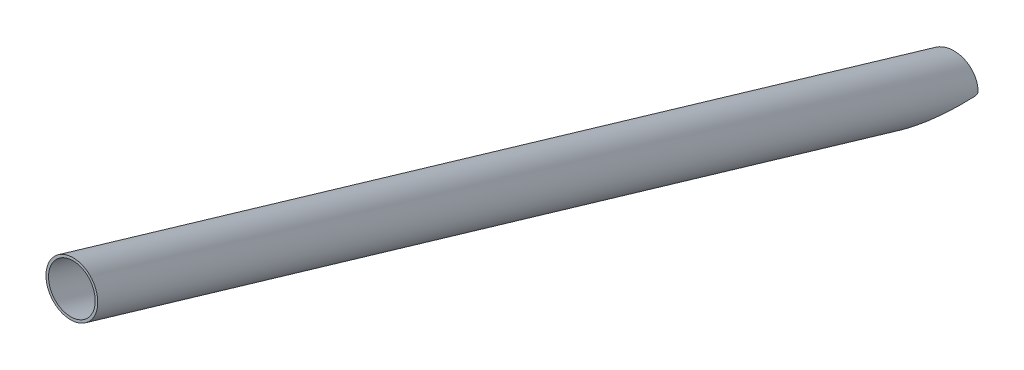
ISO-10303-21;
HEADER;
FILE_DESCRIPTION(('STEP AP214'),'2;1');
FILE_NAME('part.step','',(''),(''),'','','');
FILE_SCHEMA(('AUTOMOTIVE_DESIGN { 1 0 10303 214 1 1 1 1 }'));
ENDSEC;
DATA;
#1=APPLICATION_CONTEXT('core data for automotive mechanical design processes');
#2=APPLICATION_PROTOCOL_DEFINITION('international standard','automotive_design',2000,#1);
#3=PRODUCT_CONTEXT('',#1,'mechanical');
#4=PRODUCT('Part','Part','',(#3));
#5=PRODUCT_RELATED_PRODUCT_CATEGORY('part','',(#4));
#6=PRODUCT_DEFINITION_FORMATION('','',#4);
#7=PRODUCT_DEFINITION_CONTEXT('part definition',#1,'design');
#8=PRODUCT_DEFINITION('design','',#6,#7);
#9=PRODUCT_DEFINITION_SHAPE('','',#8);
#10=(LENGTH_UNIT() NAMED_UNIT(*) SI_UNIT(.MILLI.,.METRE.));
#11=(NAMED_UNIT(*) PLANE_ANGLE_UNIT() SI_UNIT($,.RADIAN.));
#12=(NAMED_UNIT(*) SI_UNIT($,.STERADIAN.) SOLID_ANGLE_UNIT());
#13=UNCERTAINTY_MEASURE_WITH_UNIT(LENGTH_MEASURE(1.E-05),#10,'distance_accuracy_value','');
#14=(GEOMETRIC_REPRESENTATION_CONTEXT(3) GLOBAL_UNCERTAINTY_ASSIGNED_CONTEXT((#13)) GLOBAL_UNIT_ASSIGNED_CONTEXT((#10,
#11,#12)) REPRESENTATION_CONTEXT('',''));
#15=CARTESIAN_POINT('',(0.,0.,0.));
#16=DIRECTION('',(0.,0.,1.));
#17=DIRECTION('',(1.,0.,0.));
#18=AXIS2_PLACEMENT_3D('',#15,#16,#17);
#19=CARTESIAN_POINT('',(-238.578451545622,263.413321195737,924.828445427609));
#20=DIRECTION('',(0.125935860789275,0.361465966011555,0.923841173786164));
#21=DIRECTION('',(0.,-0.93125547053293,0.364366914802225));
#22=AXIS2_PLACEMENT_3D('',#19,#20,#21);
#23=CYLINDRICAL_SURFACE('',#22,12.7);
#24=CARTESIAN_POINT('',(-170.006234196317,460.231944821897,1427.861));
#25=DIRECTION('',(0.,0.,-1.));
#26=DIRECTION('',(0.329006657768672,0.944327601600148,0.));
#27=AXIS2_PLACEMENT_3D('',#24,#25,#26);
#28=ELLIPSE('',#27,13.7469517059429,12.7);
#29=CARTESIAN_POINT('',(-165.483395561037,473.213570755683,1427.861));
#30=VERTEX_POINT('',#29);
#31=EDGE_CURVE('E158',#30,#30,#28,.T.);
#32=ORIENTED_EDGE('',*,*,#31,.T.);
#33=EDGE_LOOP('',(#32));
#34=FACE_BOUND('',#33,.T.);
#35=CARTESIAN_POINT('',(-238.578451545622,263.413321195737,924.828445427609));
#36=DIRECTION('',(-0.125935860789275,-0.361465966011555,-0.923841173786164));
#37=DIRECTION('',(0.,0.93125547053293,-0.364366914802225));
#38=AXIS2_PLACEMENT_3D('',#35,#36,#37);
#39=CIRCLE('',#38,12.7);
#40=CARTESIAN_POINT('',(-251.081438817546,262.535172699439,926.876411368864));
#41=VERTEX_POINT('',#40);
#42=CARTESIAN_POINT('',(-251.162272400533,264.573616407034,926.089860392689));
#43=VERTEX_POINT('',#42);
#44=EDGE_CURVE('E53',#41,#43,#39,.T.);
#45=ORIENTED_EDGE('',*,*,#44,.F.);
#46=CARTESIAN_POINT('',(-250.556242151783,263.705273976253,930.568275630507));
#47=CARTESIAN_POINT('',(-250.591679890808,263.692747162166,930.35505617303));
#48=CARTESIAN_POINT('',(-250.626563477498,263.680204805641,930.141739958165));
#49=CARTESIAN_POINT('',(-250.694896292358,263.653512658873,929.71681914362));
#50=CARTESIAN_POINT('',(-250.728355082375,263.639377201747,929.505215162217));
#51=CARTESIAN_POINT('',(-250.785687823963,263.611816011696,929.136232858172));
#52=CARTESIAN_POINT('',(-250.809822126205,263.599135500613,928.978844839189));
#53=CARTESIAN_POINT('',(-250.857567738819,263.570038493168,928.663214502132));
#54=CARTESIAN_POINT('',(-250.881174172364,263.553596328758,928.504973968348));
#55=CARTESIAN_POINT('',(-250.927851490643,263.513293413838,928.187518456917));
#56=CARTESIAN_POINT('',(-250.950914828331,263.489361316493,928.028309194384));
#57=CARTESIAN_POINT('',(-250.984404622596,263.439390355133,927.792861168643));
#58=CARTESIAN_POINT('',(-250.995342313322,263.420490699556,927.715241839458));
#59=CARTESIAN_POINT('',(-251.016601317001,263.374578855089,927.562433048013));
#60=CARTESIAN_POINT('',(-251.026924944019,263.347599787185,927.487235027703));
#61=CARTESIAN_POINT('',(-251.042620875733,263.292660746214,927.370054706212));
#62=CARTESIAN_POINT('',(-251.048393900079,263.268894848889,927.326226638534));
#63=CARTESIAN_POINT('',(-251.059043411533,263.214576885693,927.243004514204));
#64=CARTESIAN_POINT('',(-251.063923773435,263.184055484951,927.203591596388));
#65=CARTESIAN_POINT('',(-251.072413546349,263.115503293008,927.130951137884));
#66=CARTESIAN_POINT('',(-251.076010110848,263.077402233244,927.097787604495));
#67=CARTESIAN_POINT('',(-251.081614073025,262.995478506626,927.039196778219));
#68=CARTESIAN_POINT('',(-251.083616560906,262.95163864322,927.013793534144));
#69=CARTESIAN_POINT('',(-251.08666921081,262.840406194113,926.960029236648));
#70=CARTESIAN_POINT('',(-251.086893799656,262.771243820382,926.935420171396));
#71=CARTESIAN_POINT('',(-251.084876597143,262.630271939857,926.895410976376));
#72=CARTESIAN_POINT('',(-251.082622111923,262.558450645625,926.880058871834));
#73=CARTESIAN_POINT('',(-251.072523928205,262.331714823997,926.840299264213));
#74=CARTESIAN_POINT('',(-251.061238556869,262.175394789802,926.825514354734));
#75=CARTESIAN_POINT('',(-251.032056968746,261.862710047067,926.804838326577));
#76=CARTESIAN_POINT('',(-251.014140577809,261.706346672608,926.798974630882));
#77=CARTESIAN_POINT('',(-250.972286019535,261.393744666961,926.791500106254));
#78=CARTESIAN_POINT('',(-250.948327783011,261.237508227823,926.789903661001));
#79=CARTESIAN_POINT('',(-250.894786593018,260.926244816731,926.788758301734));
#80=CARTESIAN_POINT('',(-250.865211173792,260.77121651102,926.789206663379));
#81=CARTESIAN_POINT('',(-250.768435152783,260.308665871621,926.791964750888));
#82=CARTESIAN_POINT('',(-250.693067578914,260.002818026088,926.795682173394));
#83=CARTESIAN_POINT('',(-250.521214169932,259.396917709818,926.803156955561));
#84=CARTESIAN_POINT('',(-250.424712906181,259.096869648282,926.806914342482));
#85=CARTESIAN_POINT('',(-250.211276568941,258.50461339788,926.81311913272));
#86=CARTESIAN_POINT('',(-250.094372596908,258.212394046124,926.815568507198));
#87=CARTESIAN_POINT('',(-249.840566167649,257.636812772408,926.818423749536));
#88=CARTESIAN_POINT('',(-249.703665793054,257.353449931768,926.81882983005));
#89=CARTESIAN_POINT('',(-249.379613250768,256.738536473732,926.817006102438));
#90=CARTESIAN_POINT('',(-249.187944603153,256.40935381464,926.814205202772));
#91=CARTESIAN_POINT('',(-248.777261054299,255.768496868423,926.804528258209));
#92=CARTESIAN_POINT('',(-248.558240870682,255.456825980237,926.797651425167));
#93=CARTESIAN_POINT('',(-248.094046335052,254.853276346489,926.779523196075));
#94=CARTESIAN_POINT('',(-247.848848430215,254.561415817626,926.768267836063));
#95=CARTESIAN_POINT('',(-247.334106942527,254.000279238016,926.741198230068));
#96=CARTESIAN_POINT('',(-247.064565673123,253.731001045862,926.725384416981));
#97=CARTESIAN_POINT('',(-246.510803683587,253.224501077421,926.689601892037));
#98=CARTESIAN_POINT('',(-246.227199528773,252.986596147117,926.669760935795));
#99=CARTESIAN_POINT('',(-245.640685722603,252.536378139839,926.62564984796));
#100=CARTESIAN_POINT('',(-245.337776928344,252.324063927883,926.601379912917));
#101=CARTESIAN_POINT('',(-244.715190981461,251.927152212144,926.548479877139));
#102=CARTESIAN_POINT('',(-244.395535061115,251.74252070682,926.519855213707));
#103=CARTESIAN_POINT('',(-243.74162859965,251.402426811407,926.458337921709));
#104=CARTESIAN_POINT('',(-243.407383932293,251.246952812981,926.425447000508));
#105=CARTESIAN_POINT('',(-242.725000946741,250.9658468596,926.35537054306));
#106=CARTESIAN_POINT('',(-242.37680251561,250.840365038683,926.318164730737));
#107=CARTESIAN_POINT('',(-241.847723063689,250.67629965799,926.259449146961));
#108=CARTESIAN_POINT('',(-241.670336869003,250.625659607561,926.239405165007));
#109=CARTESIAN_POINT('',(-241.313547102368,250.532491973528,926.19837242128));
#110=CARTESIAN_POINT('',(-241.134143449176,250.489964717879,926.177383621354));
#111=CARTESIAN_POINT('',(-240.953890947372,250.451545600139,926.155937937448));
#112=B_SPLINE_CURVE_WITH_KNOTS('',3,(#46,#47,#48,#49,#50,#51,#52,#53,#54,#55,#56,#57,#58,#59,
#60,#61,#62,#63,#64,#65,#66,#67,#68,#69,#70,#71,#72,#73,#74,#75,#76,#77,#78,#79,#80,#81,#82,#83,
#84,#85,#86,#87,#88,#89,#90,#91,#92,#93,#94,#95,#96,#97,#98,#99,#100,#101,#102,#103,#104,#105,
#106,#107,#108,#109,#110,#111),.UNSPECIFIED.,.F.,.F.,(4,2,2,2,2,2,2,2,2,2,2,2,2,2,2,2,2,2,2,2,2,
2,2,2,2,2,2,2,2,2,2,2,4),(0.,0.649527257907252,1.29361789443828,1.77276904931005,
2.25529277879983,2.74256045938868,2.98427750949059,3.22501691495878,3.37511317107701,
3.52454158349251,3.67542591685391,3.82677319889924,4.04575993537191,4.26587321570897,
4.7368660275173,5.20930372302975,5.68333187435598,6.15672865240582,7.10092495025927,
8.04581286964909,8.98927280601529,9.93263455078442,11.0739835257493,12.2155532703792,
13.3581589138725,14.5006560850462,15.6113855071288,16.7220656487989,17.8313702105695,
18.9402321883333,20.0545337796509,20.6110450703062,21.1675788528366),.UNSPECIFIED.);
#113=CARTESIAN_POINT('',(-250.771915872867,263.61836397493,929.22473412895));
#114=VERTEX_POINT('',#113);
#115=EDGE_CURVE('E107',#114,#41,#112,.T.);
#116=ORIENTED_EDGE('',*,*,#115,.F.);
#117=CARTESIAN_POINT('',(-238.578451545622,263.413321195737,924.828445427609));
#118=DIRECTION('',(-0.0101939169365956,0.997147905169931,-0.0747806075978744));
#119=DIRECTION('',(0.134683246519851,0.07547221485565,0.988010307583709));
#120=AXIS2_PLACEMENT_3D('',#117,#118,#119);
#121=ELLIPSE('',#120,43.7831621348584,12.7);
#122=CARTESIAN_POINT('',(-225.653172808802,263.618363974921,925.800606021783));
#123=VERTEX_POINT('',#122);
#124=EDGE_CURVE('E98',#123,#114,#121,.F.);
#125=ORIENTED_EDGE('',*,*,#124,.F.);
#126=CARTESIAN_POINT('',(-235.261681681022,276.336746641463,923.867317506498));
#127=CARTESIAN_POINT('',(-235.093419069156,276.287579412379,923.848383436738));
#128=CARTESIAN_POINT('',(-234.926232119137,276.234718450371,923.829702826245));
#129=CARTESIAN_POINT('',(-234.594275659407,276.121732198712,923.792882699116));
#130=CARTESIAN_POINT('',(-234.429506083053,276.061607109743,923.77474316755));
#131=CARTESIAN_POINT('',(-233.939376728787,275.870581451503,923.72120425626));
#132=CARTESIAN_POINT('',(-233.618022803335,275.728979689489,923.686665025454));
#133=CARTESIAN_POINT('',(-232.989436519047,275.419121555407,923.620303970301));
#134=CARTESIAN_POINT('',(-232.682164137221,275.250947665039,923.588474191201));
#135=CARTESIAN_POINT('',(-232.08266794944,274.88914543146,923.527691566915));
#136=CARTESIAN_POINT('',(-231.790444830057,274.695515928353,923.498738852929));
#137=CARTESIAN_POINT('',(-231.223148038359,274.284681451508,923.444009180417));
#138=CARTESIAN_POINT('',(-230.948060222247,274.067496338103,923.418229585112));
#139=CARTESIAN_POINT('',(-230.416366554532,273.611214511925,923.370075538474));
#140=CARTESIAN_POINT('',(-230.159761791252,273.372116510755,923.347701287567));
#141=CARTESIAN_POINT('',(-229.666271183955,272.873716011222,923.306592696711));
#142=CARTESIAN_POINT('',(-229.429401186359,272.614397593817,923.287861266037));
#143=CARTESIAN_POINT('',(-228.97683409305,272.077680153098,923.254305833622));
#144=CARTESIAN_POINT('',(-228.761137023161,271.800281107732,923.239481836648));
#145=CARTESIAN_POINT('',(-228.344086244203,271.218400672326,923.213502639407));
#146=CARTESIAN_POINT('',(-228.143602866487,270.913288084351,923.202510411196));
#147=CARTESIAN_POINT('',(-227.767571058732,270.287942166019,923.185330250712));
#148=CARTESIAN_POINT('',(-227.592023247955,269.967708460399,923.179142437736));
#149=CARTESIAN_POINT('',(-227.266808194582,269.314667789085,923.171985496157));
#150=CARTESIAN_POINT('',(-227.117117778234,268.981872410768,923.171011670977));
#151=CARTESIAN_POINT('',(-226.844086303033,268.305833397248,923.174941466707));
#152=CARTESIAN_POINT('',(-226.720735584967,267.962593645112,923.179842928675));
#153=CARTESIAN_POINT('',(-226.505666726925,267.283462089443,923.196371499668));
#154=CARTESIAN_POINT('',(-226.412773533282,266.947936265195,923.207685549677));
#155=CARTESIAN_POINT('',(-226.291728699901,266.440864299025,923.231784622343));
#156=CARTESIAN_POINT('',(-226.254440640362,266.271277124576,923.241000628615));
#157=CARTESIAN_POINT('',(-226.185859932179,265.931102699681,923.262698539083));
#158=CARTESIAN_POINT('',(-226.154566503195,265.760515582384,923.275180017699));
#159=CARTESIAN_POINT('',(-226.102257323553,265.445768174029,923.302854490382));
#160=CARTESIAN_POINT('',(-226.080399051243,265.30168122514,923.317309844064));
#161=CARTESIAN_POINT('',(-226.040533956438,265.013586206313,923.352063476548));
#162=CARTESIAN_POINT('',(-226.022527150786,264.869578136723,923.372361780902));
#163=CARTESIAN_POINT('',(-225.996487419069,264.642730959999,923.413821691568));
#164=CARTESIAN_POINT('',(-225.987417416625,264.559318633878,923.431126084339));
#165=CARTESIAN_POINT('',(-225.97002808251,264.393928003195,923.472426649809));
#166=CARTESIAN_POINT('',(-225.961708691149,264.311949585025,923.496422289784));
#167=CARTESIAN_POINT('',(-225.948253174603,264.1816579607,923.545151433949));
#168=CARTESIAN_POINT('',(-225.943073739706,264.132071293918,923.566354519481));
#169=CARTESIAN_POINT('',(-225.932530390615,264.036342919432,923.615435696974));
#170=CARTESIAN_POINT('',(-225.927167067919,263.990191448225,923.643293843237));
#171=CARTESIAN_POINT('',(-225.91714258887,263.912818659865,923.700905405898));
#172=CARTESIAN_POINT('',(-225.912559824503,263.88046815711,923.729126840675));
#173=CARTESIAN_POINT('',(-225.903088054102,263.82134224264,923.790817587476));
#174=CARTESIAN_POINT('',(-225.898199513454,263.794558614499,923.824279035646));
#175=CARTESIAN_POINT('',(-225.888208462447,263.747275300352,923.895077570888));
#176=CARTESIAN_POINT('',(-225.883106987444,263.726748501258,923.932396969555));
#177=CARTESIAN_POINT('',(-225.872765821647,263.691208555915,924.009597880197));
#178=CARTESIAN_POINT('',(-225.867525820993,263.676209133288,924.049485484298));
#179=CARTESIAN_POINT('',(-225.847378897522,263.626928509486,924.20456876454));
#180=CARTESIAN_POINT('',(-225.832306740097,263.607507048891,924.324169563308));
#181=CARTESIAN_POINT('',(-225.802223319587,263.58295614272,924.56538797579));
#182=CARTESIAN_POINT('',(-225.787215365087,263.578014785364,924.687011668165));
#183=CARTESIAN_POINT('',(-225.750488156178,263.574596531227,924.986953574791));
#184=CARTESIAN_POINT('',(-225.728889325672,263.580188070332,925.165367150675));
#185=CARTESIAN_POINT('',(-225.697215215988,263.593385879796,925.429532186938));
#186=CARTESIAN_POINT('',(-225.686958344126,263.59845384772,925.51547688759));
#187=CARTESIAN_POINT('',(-225.666557654801,263.609818618775,925.687214116049));
#188=CARTESIAN_POINT('',(-225.656413737146,263.616114222778,925.773006710569));
#189=CARTESIAN_POINT('',(-225.64631769316,263.622872240041,925.858789337787));
#190=B_SPLINE_CURVE_WITH_KNOTS('',3,(#126,#127,#128,#129,#130,#131,#132,#133,#134,#135,#136,
#137,#138,#139,#140,#141,#142,#143,#144,#145,#146,#147,#148,#149,#150,#151,#152,#153,#154,#155,
#156,#157,#158,#159,#160,#161,#162,#163,#164,#165,#166,#167,#168,#169,#170,#171,#172,#173,#174,
#175,#176,#177,#178,#179,#180,#181,#182,#183,#184,#185,#186,#187,#188,#189),.UNSPECIFIED.,.F.,
.F.,(4,2,2,2,2,2,2,2,2,2,2,2,2,2,2,2,2,2,2,2,2,2,2,2,2,2,2,2,2,2,2,4),(0.,0.528866887560838,
1.05771916782239,2.11488001507027,3.16882159710276,4.22281121911178,5.2759190040167,
6.32908874759194,7.38309616397585,8.43710486591089,9.53163822741622,10.6261987663237,
11.7197731973504,12.8129459047656,13.856852713198,14.3783965722083,14.8998724938923,
15.3391407754548,15.7784109780281,16.0353079742107,16.2921845233229,16.4544007568596,
16.6161367849022,16.7450497644034,16.8737711021195,17.0019264431891,17.1303978638627,
17.493660837818,17.8616219189734,18.400485792463,18.6606098885089,18.9204811622921),.UNSPECIFIED.);
#191=CARTESIAN_POINT('',(-228.310650750519,271.159917359586,923.212127422704));
#192=VERTEX_POINT('',#191);
#193=EDGE_CURVE('E80',#192,#123,#190,.T.);
#194=ORIENTED_EDGE('',*,*,#193,.F.);
#195=CARTESIAN_POINT('',(-238.578451545622,263.413321195737,924.828445427609));
#196=DIRECTION('',(0.122453148788954,0.0445630118117611,0.991473330115306));
#197=DIRECTION('',(0.0309977592476804,0.998332347767804,-0.0486997158312927));
#198=AXIS2_PLACEMENT_3D('',#195,#196,#197);
#199=ELLIPSE('',#198,13.4037909779089,12.7);
#200=CARTESIAN_POINT('',(-248.342187202407,271.900947930086,925.65284073898));
#201=VERTEX_POINT('',#200);
#202=EDGE_CURVE('E112',#201,#192,#199,.F.);
#203=ORIENTED_EDGE('',*,*,#202,.F.);
#204=CARTESIAN_POINT('',(-251.482839229475,263.755883172903,923.637135312618));
#205=CARTESIAN_POINT('',(-251.472663810415,263.760461823639,923.737837033012));
#206=CARTESIAN_POINT('',(-251.462317682054,263.76553459602,923.83848129866));
#207=CARTESIAN_POINT('',(-251.441267867152,263.77702216988,924.039735614232));
#208=CARTESIAN_POINT('',(-251.430563904659,263.783438028154,924.140345574347));
#209=CARTESIAN_POINT('',(-251.397696252105,263.805366438891,924.444032753649));
#210=CARTESIAN_POINT('',(-251.374981602088,263.823481960471,924.64693652711));
#211=CARTESIAN_POINT('',(-251.340204704666,263.86305060858,924.944904544668));
#212=CARTESIAN_POINT('',(-251.328779543684,263.87781124987,925.040907204579));
#213=CARTESIAN_POINT('',(-251.305498549395,263.914286799274,925.231610641411));
#214=CARTESIAN_POINT('',(-251.293643127205,263.935995216197,925.326312547814));
#215=CARTESIAN_POINT('',(-251.274260599208,263.981188090942,925.475003728383));
#216=CARTESIAN_POINT('',(-251.266884745214,264.000542010742,925.530222773682));
#217=CARTESIAN_POINT('',(-251.251990118362,264.046272344997,925.637652783703));
#218=CARTESIAN_POINT('',(-251.244471813075,264.072628575014,925.689871877894));
#219=CARTESIAN_POINT('',(-251.231144536672,264.127589550342,925.777039697638));
#220=CARTESIAN_POINT('',(-251.225343621145,264.154254401644,925.81318468086));
#221=CARTESIAN_POINT('',(-251.213831846499,264.213515934521,925.880211986492));
#222=CARTESIAN_POINT('',(-251.208120848431,264.24610223019,925.91110334268));
#223=CARTESIAN_POINT('',(-251.196880369412,264.316193927695,925.966529649811));
#224=CARTESIAN_POINT('',(-251.191350620254,264.353691608987,925.991074400966));
#225=CARTESIAN_POINT('',(-251.18044792727,264.432030235221,926.034167193501));
#226=CARTESIAN_POINT('',(-251.175075345447,264.472878182698,926.052702251797));
#227=CARTESIAN_POINT('',(-251.156296106051,264.619513473538,926.109416796854));
#228=CARTESIAN_POINT('',(-251.143038914411,264.730001501201,926.134860618722));
#229=CARTESIAN_POINT('',(-251.115261735679,264.953374791604,926.171728512606));
#230=CARTESIAN_POINT('',(-251.100730410589,265.066272984473,926.183009321676));
#231=CARTESIAN_POINT('',(-251.067989062187,265.304829654429,926.199177081081));
#232=CARTESIAN_POINT('',(-251.049549947514,265.430518939597,926.203219267067));
#233=CARTESIAN_POINT('',(-251.009794494539,265.681520827392,926.206454595643));
#234=CARTESIAN_POINT('',(-250.988475975249,265.806833070156,926.205644042193));
#235=CARTESIAN_POINT('',(-250.919813149117,266.182231362934,926.198890061546));
#236=CARTESIAN_POINT('',(-250.867810748478,266.431406735155,926.188613964382));
#237=CARTESIAN_POINT('',(-250.75095038101,266.925735079123,926.16272075769));
#238=CARTESIAN_POINT('',(-250.686124494018,267.170896467992,926.147116906991));
#239=CARTESIAN_POINT('',(-250.54351166721,267.656983199671,926.112538168738));
#240=CARTESIAN_POINT('',(-250.465733924345,267.897911415145,926.093565672587));
#241=CARTESIAN_POINT('',(-250.253604971159,268.498550868612,926.042865264121));
#242=CARTESIAN_POINT('',(-250.110809983969,268.855190449493,926.009618419982));
#243=CARTESIAN_POINT('',(-249.795949842292,269.555119577537,925.939432916307));
#244=CARTESIAN_POINT('',(-249.623869760222,269.898402206027,925.902492377955));
#245=CARTESIAN_POINT('',(-249.251152913464,270.569317855583,925.825723716908));
#246=CARTESIAN_POINT('',(-249.050482607093,270.896931882771,925.785892229905));
#247=CARTESIAN_POINT('',(-248.62190332163,271.53346644663,925.703938899082));
#248=CARTESIAN_POINT('',(-248.3939984031,271.842389759686,925.661817397203));
#249=CARTESIAN_POINT('',(-247.913474611792,272.437596704789,925.575896362917));
#250=CARTESIAN_POINT('',(-247.66098302096,272.723984371575,925.532106119425));
#251=CARTESIAN_POINT('',(-247.131900008741,273.273374301137,925.442982484211));
#252=CARTESIAN_POINT('',(-246.855306318577,273.536374357674,925.397648947462));
#253=CARTESIAN_POINT('',(-246.280237280996,274.036254016919,925.305802506259));
#254=CARTESIAN_POINT('',(-245.981789649028,274.273165781642,925.259291142908));
#255=CARTESIAN_POINT('',(-245.364830971915,274.718930228829,925.165328474412));
#256=CARTESIAN_POINT('',(-245.046325690369,274.927790918263,925.117877441944));
#257=CARTESIAN_POINT('',(-244.499733586466,275.251363534144,925.038101135427));
#258=CARTESIAN_POINT('',(-244.276501742409,275.374396761291,925.005952838867));
#259=CARTESIAN_POINT('',(-243.822862523078,275.606360445874,924.941448751425));
#260=CARTESIAN_POINT('',(-243.592455868478,275.715292314087,924.909092981639));
#261=CARTESIAN_POINT('',(-243.12533806242,275.918485998894,924.844270659131));
#262=CARTESIAN_POINT('',(-242.888628278491,276.012750967734,924.81180413175));
#263=CARTESIAN_POINT('',(-242.409663395588,276.186195320161,924.746836483007));
#264=CARTESIAN_POINT('',(-242.167406533528,276.265369830689,924.714335353867));
#265=CARTESIAN_POINT('',(-241.922856229265,276.336746641463,924.681868992893));
#266=B_SPLINE_CURVE_WITH_KNOTS('',3,(#204,#205,#206,#207,#208,#209,#210,#211,#212,#213,#214,
#215,#216,#217,#218,#219,#220,#221,#222,#223,#224,#225,#226,#227,#228,#229,#230,#231,#232,#233,
#234,#235,#236,#237,#238,#239,#240,#241,#242,#243,#244,#245,#246,#247,#248,#249,#250,#251,#252,
#253,#254,#255,#256,#257,#258,#259,#260,#261,#262,#263,#264,#265),.UNSPECIFIED.,.F.,.F.,(4,2,2,
2,2,2,2,2,2,2,2,2,2,2,2,2,2,2,2,2,2,2,2,2,2,2,2,2,2,2,4),(0.,0.303915050212,0.608070138196632,
1.22250912395415,1.5158227356087,1.80886310524148,1.98550468912372,2.16164251942608,
2.29692074411873,2.43196394864242,2.56679736164829,2.70192015167413,3.04158677634158,
3.38466224856767,3.76566691773956,4.14696181218221,4.91067609646613,5.67250346321676,
6.43379215477638,7.58916308710606,8.74512472396019,9.902453861449,11.0596106609606,
12.2110668430797,13.3626315313488,14.5127602737758,15.6625600196664,16.4328505688959,
17.2030639944272,17.9731116544191,18.7434075609119),.UNSPECIFIED.);
#267=EDGE_CURVE('E93',#43,#201,#266,.T.);
#268=ORIENTED_EDGE('',*,*,#267,.F.);
#269=EDGE_LOOP('',(#45,#116,#125,#194,#203,#268));
#270=FACE_BOUND('',#269,.T.);
#271=ADVANCED_FACE('F43',(#34,#270),#23,.T.);
#272=CARTESIAN_POINT('',(-208.251472327974,334.119757295629,939.246490328731));
#273=DIRECTION('',(-0.91417607002451,0.350648849154007,0.203291656448346));
#274=DIRECTION('',(-0.358127179628742,-0.933672813790336,0.));
#275=AXIS2_PLACEMENT_3D('',#272,#273,#274);
#276=TOROIDAL_SURFACE('',#275,78.232,12.7);
#277=ORIENTED_EDGE('',*,*,#115,.T.);
#278=CARTESIAN_POINT('',(-247.569967494976,254.120998290724,929.689900950129));
#279=CARTESIAN_POINT('',(-247.849618544606,254.452557918491,929.59829491666));
#280=CARTESIAN_POINT('',(-248.113307165257,254.795520758683,929.500051253691));
#281=CARTESIAN_POINT('',(-248.608031845437,255.500424535188,929.291687357895));
#282=CARTESIAN_POINT('',(-248.839094644035,255.862349593165,929.181576982698));
#283=CARTESIAN_POINT('',(-249.267283723799,256.600151934993,928.951271079573));
#284=CARTESIAN_POINT('',(-249.464565940936,256.975954806754,928.831125923255));
#285=CARTESIAN_POINT('',(-249.826460320117,257.740051307731,928.581494919313));
#286=CARTESIAN_POINT('',(-249.991065738671,258.128347496012,928.452007151162));
#287=CARTESIAN_POINT('',(-250.287138943993,258.913083594464,928.185328023934));
#288=CARTESIAN_POINT('',(-250.41871889578,259.309490854924,928.048164729592));
#289=CARTESIAN_POINT('',(-250.649778920487,260.109224638504,927.766755101071));
#290=CARTESIAN_POINT('',(-250.749247917908,260.51255349857,927.622506342741));
#291=CARTESIAN_POINT('',(-250.916458626738,261.323873597463,927.327859615073));
#292=CARTESIAN_POINT('',(-250.984175121234,261.731868279245,927.177456861119));
#293=CARTESIAN_POINT('',(-251.08821836296,262.550064505275,926.871508910277));
#294=CARTESIAN_POINT('',(-251.124533914256,262.960266784227,926.715961899723));
#295=CARTESIAN_POINT('',(-251.168833119468,263.832472625787,926.380737753704));
#296=CARTESIAN_POINT('',(-251.172657935965,264.29447357901,926.200494716241));
#297=CARTESIAN_POINT('',(-251.141690384774,265.215550471319,925.835888890669));
#298=CARTESIAN_POINT('',(-251.106895283099,265.674626201009,925.6515258118));
#299=CARTESIAN_POINT('',(-250.999250318835,266.587634185067,925.27962457605));
#300=CARTESIAN_POINT('',(-250.926355855658,267.041559772806,925.092082947735));
#301=CARTESIAN_POINT('',(-250.743059120596,267.941003753874,924.715176148731));
#302=CARTESIAN_POINT('',(-250.632654594297,268.386521640186,924.525810869103));
#303=CARTESIAN_POINT('',(-250.364347960406,269.301992479767,924.131044984417));
#304=CARTESIAN_POINT('',(-250.203333109657,269.771017995603,923.925582930569));
#305=CARTESIAN_POINT('',(-249.838574717057,270.692306361853,923.51539277864));
#306=CARTESIAN_POINT('',(-249.63481955448,271.144564613956,923.310664895602));
#307=CARTESIAN_POINT('',(-248.960788908512,272.468101036583,922.700930217025));
#308=CARTESIAN_POINT('',(-248.426560278233,273.310249840878,922.298602756387));
#309=CARTESIAN_POINT('',(-247.649328656104,274.293539064126,921.807926506856));
#310=CARTESIAN_POINT('',(-247.483401383866,274.49222231133,921.707570051256));
#311=CARTESIAN_POINT('',(-247.140375170369,274.880471151315,921.508901656));
#312=CARTESIAN_POINT('',(-246.963284397761,275.070043236017,921.410588289818));
#313=CARTESIAN_POINT('',(-246.780490605973,275.254814558581,921.313375867742));
#314=B_SPLINE_CURVE_WITH_KNOTS('',3,(#278,#279,#280,#281,#282,#283,#284,#285,#286,#287,#288,
#289,#290,#291,#292,#293,#294,#295,#296,#297,#298,#299,#300,#301,#302,#303,#304,#305,#306,#307,
#308,#309,#310,#311,#312,#313),.UNSPECIFIED.,.F.,.F.,(4,2,2,2,2,2,2,2,2,2,2,2,2,2,2,2,2,4),(0.,
1.32921996930931,2.65734414985853,3.97916179633022,5.30125194255772,6.61878916469995,
7.93678033883428,9.25581645774108,10.5753226822393,12.0615256170148,13.5478337700011,
15.0358857628494,16.5240272057973,18.1321963242651,19.7408032583025,22.9442937285398,
23.7769505120914,24.6090049345701),.UNSPECIFIED.);
#315=EDGE_CURVE('E142',#41,#43,#314,.T.);
#316=ORIENTED_EDGE('',*,*,#315,.T.);
#317=ORIENTED_EDGE('',*,*,#267,.T.);
#318=CARTESIAN_POINT('',(-238.854339974652,264.133570696327,922.345484409334));
#319=DIRECTION('',(0.106111176080036,-0.277019670043188,0.954987183537075));
#320=DIRECTION('',(0.,-0.96040939371061,-0.278592527667951));
#321=AXIS2_PLACEMENT_3D('',#318,#319,#320);
#322=CIRCLE('',#321,12.7);
#323=EDGE_CURVE('E87',#192,#201,#322,.T.);
#324=ORIENTED_EDGE('',*,*,#323,.F.);
#325=ORIENTED_EDGE('',*,*,#193,.T.);
#326=CARTESIAN_POINT('',(-238.235643171693,262.849093525537,927.343221509409));
#327=DIRECTION('',(-0.131849675086013,0.217011136973921,-0.967223774319572));
#328=DIRECTION('',(0.,0.975742274934391,0.218922390142852));
#329=AXIS2_PLACEMENT_3D('',#326,#327,#328);
#330=CIRCLE('',#329,12.7);
#331=CARTESIAN_POINT('',(-227.552862031758,269.716483015888,927.42777151862));
#332=VERTEX_POINT('',#331);
#333=EDGE_CURVE('E84',#332,#123,#330,.T.);
#334=ORIENTED_EDGE('',*,*,#333,.F.);
#335=CARTESIAN_POINT('',(-248.612995291172,269.429926550276,930.568275630507));
#336=CARTESIAN_POINT('',(-248.587653636414,269.502621675781,930.492641352761));
#337=CARTESIAN_POINT('',(-248.560526518938,269.576437092435,930.418712730034));
#338=CARTESIAN_POINT('',(-248.502710735761,269.725946425285,930.274258994476));
#339=CARTESIAN_POINT('',(-248.472022856208,269.801639923944,930.203733135227));
#340=CARTESIAN_POINT('',(-248.374757267799,270.030706634905,929.99750248922));
#341=CARTESIAN_POINT('',(-248.302865911406,270.186389354344,929.86681170028));
#342=CARTESIAN_POINT('',(-248.146129029357,270.499504667158,929.619344423958));
#343=CARTESIAN_POINT('',(-248.061405654873,270.656908984246,929.502453504492));
#344=CARTESIAN_POINT('',(-247.879185695661,270.972444769263,929.279993226942));
#345=CARTESIAN_POINT('',(-247.781681349612,271.130576622233,929.17443081958));
#346=CARTESIAN_POINT('',(-247.543143774138,271.493381659549,928.942709617657));
#347=CARTESIAN_POINT('',(-247.397902383109,271.697546604165,928.820082840058));
#348=CARTESIAN_POINT('',(-247.088773713749,272.099676598083,928.58906733333));
#349=CARTESIAN_POINT('',(-246.92488280672,272.297640431226,928.480681383957));
#350=CARTESIAN_POINT('',(-246.579412781145,272.685294519762,928.275237462879));
#351=CARTESIAN_POINT('',(-246.397768733339,272.874950428999,928.178224162185));
#352=CARTESIAN_POINT('',(-246.018829937296,273.242957464768,927.993931998718));
#353=CARTESIAN_POINT('',(-245.821536134786,273.421309273246,927.906652548487));
#354=CARTESIAN_POINT('',(-245.408111409136,273.768790369675,927.738320205978));
#355=CARTESIAN_POINT('',(-245.191657897612,273.937624217875,927.657450208241));
#356=CARTESIAN_POINT('',(-244.745286899919,274.260051903521,927.502825088305));
#357=CARTESIAN_POINT('',(-244.515369349992,274.413645668789,927.429069999802));
#358=CARTESIAN_POINT('',(-244.043694357388,274.704129322245,927.287727172521));
#359=CARTESIAN_POINT('',(-243.801947178277,274.841033342848,927.220134228213));
#360=CARTESIAN_POINT('',(-243.307867208274,275.097141833568,927.090304246066));
#361=CARTESIAN_POINT('',(-243.055534019272,275.216345637265,927.028067409922));
#362=CARTESIAN_POINT('',(-242.509211913771,275.449974816314,926.900840760059));
#363=CARTESIAN_POINT('',(-242.213992474719,275.561886572764,926.836499226096));
#364=CARTESIAN_POINT('',(-241.614124112508,275.760812488769,926.713429440663));
#365=CARTESIAN_POINT('',(-241.309474422828,275.847824618479,926.654701647092));
#366=CARTESIAN_POINT('',(-240.692881873159,275.996045430655,926.542558994387));
#367=CARTESIAN_POINT('',(-240.380936496074,276.057245064657,926.48914600334));
#368=CARTESIAN_POINT('',(-239.75216245324,276.153126265843,926.3875546221));
#369=CARTESIAN_POINT('',(-239.435333918145,276.187808541273,926.339376092129));
#370=CARTESIAN_POINT('',(-238.800809260617,276.230149068175,926.248546731678));
#371=CARTESIAN_POINT('',(-238.483126622538,276.237949487106,926.205867973845));
#372=CARTESIAN_POINT('',(-237.847546601618,276.226808064409,926.125932910726));
#373=CARTESIAN_POINT('',(-237.529649218257,276.207866157695,926.088676618639));
#374=CARTESIAN_POINT('',(-236.895992905968,276.143409880624,926.0199190522));
#375=CARTESIAN_POINT('',(-236.580233601474,276.097900306305,925.988416740477));
#376=CARTESIAN_POINT('',(-235.953036178375,275.98075470001,925.931622394459));
#377=CARTESIAN_POINT('',(-235.641598032913,275.909118830485,925.90633032155));
#378=CARTESIAN_POINT('',(-235.027669178951,275.741112464056,925.862746578651));
#379=CARTESIAN_POINT('',(-234.725126742613,275.644944954499,925.844400390189));
#380=CARTESIAN_POINT('',(-234.128399386877,275.428557017883,925.815195730169));
#381=CARTESIAN_POINT('',(-233.83421449958,275.308336498454,925.804337287368));
#382=CARTESIAN_POINT('',(-233.255874929908,275.044959177858,925.791088156419));
#383=CARTESIAN_POINT('',(-232.971726797496,274.901787724527,925.788702900343));
#384=CARTESIAN_POINT('',(-232.415377861228,274.594020949651,925.793676458802));
#385=CARTESIAN_POINT('',(-232.143176830242,274.429426035629,925.801035088012));
#386=CARTESIAN_POINT('',(-231.608272636967,274.077903851144,925.827319949652));
#387=CARTESIAN_POINT('',(-231.345774399057,273.890677438574,925.846418817576));
#388=CARTESIAN_POINT('',(-230.836117498505,273.498035366219,925.898567286091));
#389=CARTESIAN_POINT('',(-230.588961796379,273.292616214383,925.931619569613));
#390=CARTESIAN_POINT('',(-230.111600750254,272.866456838214,926.014595976955));
#391=CARTESIAN_POINT('',(-229.881381437798,272.645729538106,926.064506002814));
#392=CARTESIAN_POINT('',(-229.439003590188,272.192254867578,926.185106326837));
#393=CARTESIAN_POINT('',(-229.226834979689,271.959514320707,926.25578493318));
#394=CARTESIAN_POINT('',(-228.899296597351,271.577226251567,926.391013862827));
#395=CARTESIAN_POINT('',(-228.777954268953,271.429925305966,926.447559188499));
#396=CARTESIAN_POINT('',(-228.542904462925,271.134030190949,926.571954946154));
#397=CARTESIAN_POINT('',(-228.429194758229,270.985436413177,926.639802060178));
#398=CARTESIAN_POINT('',(-228.209933130905,270.689083041436,926.788174493069));
#399=CARTESIAN_POINT('',(-228.104364456857,270.541322347691,926.868672683295));
#400=CARTESIAN_POINT('',(-227.901443876026,270.248611869727,927.043927365695));
#401=CARTESIAN_POINT('',(-227.80409025875,270.103661505222,927.138680878215));
#402=CARTESIAN_POINT('',(-227.634026994942,269.843948736123,927.325822252024));
#403=CARTESIAN_POINT('',(-227.559971460053,269.728310462433,927.415770673509));
#404=CARTESIAN_POINT('',(-227.417769117395,269.502484555829,927.606506621595));
#405=CARTESIAN_POINT('',(-227.349620888951,269.392295615134,927.707291528945));
#406=CARTESIAN_POINT('',(-227.219268260861,269.179046725963,927.919542701439));
#407=CARTESIAN_POINT('',(-227.157060353858,269.075982580829,928.031002584883));
#408=CARTESIAN_POINT('',(-227.03841919291,268.878322715598,928.264045028686));
#409=CARTESIAN_POINT('',(-226.981985875495,268.783726902425,928.385627477758));
#410=CARTESIAN_POINT('',(-226.874711686051,268.604161829653,928.637631437973));
#411=CARTESIAN_POINT('',(-226.823860915216,268.519175522474,928.768036618627));
#412=CARTESIAN_POINT('',(-226.727208390156,268.359095535338,929.036559942675));
#413=CARTESIAN_POINT('',(-226.681407266095,268.284003089846,929.174679045485));
#414=CARTESIAN_POINT('',(-226.594316819118,268.143651453261,929.457268221061));
#415=CARTESIAN_POINT('',(-226.553030204725,268.078398156458,929.601742034305));
#416=CARTESIAN_POINT('',(-226.474431153032,267.95734150075,929.895639147716));
#417=CARTESIAN_POINT('',(-226.437118979747,267.901538769481,930.045062775827));
#418=CARTESIAN_POINT('',(-226.387061052285,267.829241050581,930.257829372989));
#419=CARTESIAN_POINT('',(-226.372879833317,267.809075428657,930.319619654986));
#420=CARTESIAN_POINT('',(-226.345080442523,267.770184628189,930.443616312826));
#421=CARTESIAN_POINT('',(-226.331461062622,267.751456275551,930.5058214215));
#422=CARTESIAN_POINT('',(-226.318087971273,267.733394850261,930.568275630507));
#423=B_SPLINE_CURVE_WITH_KNOTS('',3,(#335,#336,#337,#338,#339,#340,#341,#342,#343,#344,#345,
#346,#347,#348,#349,#350,#351,#352,#353,#354,#355,#356,#357,#358,#359,#360,#361,#362,#363,#364,
#365,#366,#367,#368,#369,#370,#371,#372,#373,#374,#375,#376,#377,#378,#379,#380,#381,#382,#383,
#384,#385,#386,#387,#388,#389,#390,#391,#392,#393,#394,#395,#396,#397,#398,#399,#400,#401,#402,
#403,#404,#405,#406,#407,#408,#409,#410,#411,#412,#413,#414,#415,#416,#417,#418,#419,#420,#421,
#422),.UNSPECIFIED.,.F.,.F.,(4,2,2,2,2,2,2,2,2,2,2,2,2,2,2,2,2,2,2,2,2,2,2,2,2,2,2,2,2,2,2,2,2,
2,2,2,2,2,2,2,2,2,2,4),(0.,0.323695612554413,0.647319894651159,1.29314253796377,
1.93316454311996,2.57357702170603,3.40922713480871,4.24504012203473,5.08403329799945,
5.92297581152134,6.78067969951548,7.63838764941946,8.4953641953538,9.35237299857692,
10.3178331147805,11.2833719139173,12.2492488979645,13.2151000837312,14.1758353613501,
15.1365729772039,16.0971372127319,17.0576954756564,18.0105497648668,18.9634077134051,
19.916876418928,20.8703269899716,21.838144623566,22.8061484316927,23.7733447040213,
24.7399975260659,25.3367374421217,25.9333024760795,26.528605280654,27.1237838271538,
27.6157459857562,28.1075895000293,28.5991407948722,29.0906866863228,29.5813464043214,
30.0720672844577,30.5630809802297,31.0541272727491,31.2536932547335,31.4528050085977),.UNSPECIFIED.);
#424=CARTESIAN_POINT('',(-248.506011048118,269.716483015889,930.284055620797));
#425=VERTEX_POINT('',#424);
#426=EDGE_CURVE('E92',#425,#332,#423,.T.);
#427=ORIENTED_EDGE('',*,*,#426,.F.);
#428=EDGE_CURVE('E105',#114,#425,#330,.T.);
#429=ORIENTED_EDGE('',*,*,#428,.F.);
#430=EDGE_LOOP('',(#277,#316,#317,#324,#325,#334,#427,#429));
#431=FACE_BOUND('',#430,.T.);
#432=ADVANCED_FACE('F83',(#431),#276,.F.);
#433=CARTESIAN_POINT('',(-238.578451545622,263.413321195737,924.828445427609));
#434=DIRECTION('',(0.125935860789275,0.361465966011555,0.923841173786164));
#435=DIRECTION('',(0.,-0.93125547053293,0.364366914802225));
#436=AXIS2_PLACEMENT_3D('',#433,#434,#435);
#437=CYLINDRICAL_SURFACE('',#436,11.4554);
#438=CARTESIAN_POINT('',(-170.006234196317,460.231944821897,1427.861));
#439=DIRECTION('',(0.,0.,-1.));
#440=DIRECTION('',(0.329006657768672,0.944327601600148,0.));
#441=AXIS2_PLACEMENT_3D('',#438,#439,#440);
#442=ELLIPSE('',#441,12.3997504387605,11.4554);
#443=CARTESIAN_POINT('',(-165.926633747294,471.941371414172,1427.861));
#444=VERTEX_POINT('',#443);
#445=EDGE_CURVE('E11',#444,#444,#442,.T.);
#446=ORIENTED_EDGE('',*,*,#445,.F.);
#447=EDGE_LOOP('',(#446));
#448=FACE_BOUND('',#447,.T.);
#449=ORIENTED_EDGE('',*,*,#426,.T.);
#450=CARTESIAN_POINT('',(-227.552862031758,269.716483015888,927.42777151862));
#451=CARTESIAN_POINT('',(-227.46727037952,269.582009886928,927.535911010474));
#452=CARTESIAN_POINT('',(-227.385769673,269.450302910583,927.650778769891));
#453=CARTESIAN_POINT('',(-227.23083135447,269.194310886117,927.893311327436));
#454=CARTESIAN_POINT('',(-227.157388986822,269.070021480479,928.020968491845));
#455=CARTESIAN_POINT('',(-227.019562388341,268.832682613731,928.286211823569));
#456=CARTESIAN_POINT('',(-226.955042280723,268.719474675359,928.423585468566));
#457=CARTESIAN_POINT('',(-226.833157040512,268.503018111921,928.708925014671));
#458=CARTESIAN_POINT('',(-226.775792459454,268.399770254699,928.856891730891));
#459=CARTESIAN_POINT('',(-226.653386378087,268.177950337188,929.202097764279));
#460=CARTESIAN_POINT('',(-226.590305074256,268.062509275857,929.402046606235));
#461=CARTESIAN_POINT('',(-226.473232827881,267.848142322168,929.813140976125));
#462=CARTESIAN_POINT('',(-226.419246052451,267.749224000705,930.024291578758));
#463=CARTESIAN_POINT('',(-226.318626645649,267.56604150977,930.456096872607));
#464=CARTESIAN_POINT('',(-226.272041893073,267.481872409846,930.676802550748));
#465=CARTESIAN_POINT('',(-226.185324097653,267.327114665117,931.124043090348));
#466=CARTESIAN_POINT('',(-226.145189977879,267.256523753054,931.350576971451));
#467=CARTESIAN_POINT('',(-226.054763211346,267.100172545098,931.90222033109));
#468=CARTESIAN_POINT('',(-226.007123608585,267.020193316487,932.229390785992));
#469=CARTESIAN_POINT('',(-225.920118490023,266.878435096824,932.888807321275));
#470=CARTESIAN_POINT('',(-225.880758161544,266.816667506471,933.22105644467));
#471=CARTESIAN_POINT('',(-225.808673827946,266.707299847143,933.889316334082));
#472=CARTESIAN_POINT('',(-225.775964944158,266.659731947318,934.225333878569));
#473=CARTESIAN_POINT('',(-225.716221402638,266.575895290555,934.899163201853));
#474=CARTESIAN_POINT('',(-225.689185499833,266.539624053444,935.23697457023));
#475=CARTESIAN_POINT('',(-225.639853127659,266.47577849221,935.916585510961));
#476=CARTESIAN_POINT('',(-225.617597842665,266.448278823542,936.258394918396));
#477=CARTESIAN_POINT('',(-225.57762045084,266.400582360213,936.942787415804));
#478=CARTESIAN_POINT('',(-225.5598985208,266.380385850346,937.285370535424));
#479=CARTESIAN_POINT('',(-225.528690577935,266.345943144672,937.970517623662));
#480=CARTESIAN_POINT('',(-225.515198411343,266.331688294454,938.313080888322));
#481=CARTESIAN_POINT('',(-225.492214088872,266.308027638058,938.998502044977));
#482=CARTESIAN_POINT('',(-225.482721918799,266.298621814673,939.341359935922));
#483=CARTESIAN_POINT('',(-225.466417430734,266.282648314995,940.081848863159));
#484=CARTESIAN_POINT('',(-225.460272408586,266.276770948697,940.479509337203));
#485=CARTESIAN_POINT('',(-225.453127093845,266.26941491549,941.274920480221));
#486=CARTESIAN_POINT('',(-225.452126941463,266.267936368459,941.672671151359));
#487=CARTESIAN_POINT('',(-225.456845782664,266.268895564471,942.865976570837));
#488=CARTESIAN_POINT('',(-225.47028567954,266.276729409789,943.661511511098));
#489=CARTESIAN_POINT('',(-225.518699270037,266.302411851552,945.253282705121));
#490=CARTESIAN_POINT('',(-225.553714456577,266.320279739272,946.049517351032));
#491=CARTESIAN_POINT('',(-225.647204303632,266.363237688409,947.64034099638));
#492=CARTESIAN_POINT('',(-225.705676433092,266.38832697054,948.434930164073));
#493=CARTESIAN_POINT('',(-225.848502167148,266.443594845382,950.016477384894));
#494=CARTESIAN_POINT('',(-225.932685944236,266.473739474899,950.803451556407));
#495=CARTESIAN_POINT('',(-226.08162948114,266.521815131151,951.981035913078));
#496=CARTESIAN_POINT('',(-226.13506653046,266.538319909769,952.373152246599));
#497=CARTESIAN_POINT('',(-226.250210899783,266.572139170944,953.15612866438));
#498=CARTESIAN_POINT('',(-226.311917915621,266.589453623706,953.5469887943));
#499=CARTESIAN_POINT('',(-226.444273795493,266.624712595634,954.326151538917));
#500=CARTESIAN_POINT('',(-226.514899667932,266.642655411941,954.714458120622));
#501=CARTESIAN_POINT('',(-226.666242760957,266.679085323914,955.489060398442));
#502=CARTESIAN_POINT('',(-226.746959338639,266.697572384849,955.875356221035));
#503=CARTESIAN_POINT('',(-226.919727583077,266.734956692184,956.645187637849));
#504=CARTESIAN_POINT('',(-227.011773407423,266.753853723059,957.028724547704));
#505=CARTESIAN_POINT('',(-227.20884119118,266.791934074601,957.792410972965));
#506=CARTESIAN_POINT('',(-227.313861180584,266.811117351418,958.172560993264));
#507=CARTESIAN_POINT('',(-227.485502426949,266.840475214373,958.7488046323));
#508=CARTESIAN_POINT('',(-227.546660904375,266.850599644222,958.946533371515));
#509=CARTESIAN_POINT('',(-227.673518531398,266.87086188391,959.3405265793));
#510=CARTESIAN_POINT('',(-227.739217657083,266.880999693677,959.536791055575));
#511=CARTESIAN_POINT('',(-227.943828609711,266.911404732344,960.123231948018));
#512=CARTESIAN_POINT('',(-228.09019403313,266.931653113053,960.510851118179));
#513=CARTESIAN_POINT('',(-228.406340363264,266.971723618364,961.274363745663));
#514=CARTESIAN_POINT('',(-228.575999940269,266.991547373361,961.650306327971));
#515=CARTESIAN_POINT('',(-228.852878174392,267.020715981299,962.202820600411));
#516=CARTESIAN_POINT('',(-228.948859474211,267.030340604675,962.385021388415));
#517=CARTESIAN_POINT('',(-229.149291100252,267.049329488494,962.744697401456));
#518=CARTESIAN_POINT('',(-229.253739259659,267.058693814733,962.922173820191));
#519=CARTESIAN_POINT('',(-229.440332325775,267.074386100571,963.220178244943));
#520=CARTESIAN_POINT('',(-229.520081342232,267.080802065038,963.342199492284));
#521=CARTESIAN_POINT('',(-229.684848921765,267.093413725067,963.582626019365));
#522=CARTESIAN_POINT('',(-229.76986734992,267.099609426261,963.701031391571));
#523=CARTESIAN_POINT('',(-230.033887199144,267.11781405848,964.050182373325));
#524=CARTESIAN_POINT('',(-230.221644463513,267.129422473736,964.274521407626));
#525=CARTESIAN_POINT('',(-230.626930653259,267.151129362862,964.70009364716));
#526=CARTESIAN_POINT('',(-230.844779232345,267.161208789684,964.90102911984));
#527=CARTESIAN_POINT('',(-231.311679641907,267.17880283304,965.262811282226));
#528=CARTESIAN_POINT('',(-231.560626115309,267.186325804753,965.423788093324));
#529=CARTESIAN_POINT('',(-232.006630527762,267.195993288577,965.647621163828));
#530=CARTESIAN_POINT('',(-232.196118254048,267.199080232517,965.725428243925));
#531=CARTESIAN_POINT('',(-232.585504603383,267.203210246543,965.848024071581));
#532=CARTESIAN_POINT('',(-232.785392724677,267.204255338788,965.892845459215));
#533=CARTESIAN_POINT('',(-233.190210430181,267.20418130859,965.946784010211));
#534=CARTESIAN_POINT('',(-233.395146694075,267.203059147711,965.955850992545));
#535=CARTESIAN_POINT('',(-233.803624743388,267.198777385125,965.939460513406));
#536=CARTESIAN_POINT('',(-234.007164930296,267.195615748118,965.913968535702));
#537=CARTESIAN_POINT('',(-234.471618253528,267.186286744318,965.819940139942));
#538=CARTESIAN_POINT('',(-234.730228406346,267.179483760369,965.740306574305));
#539=CARTESIAN_POINT('',(-235.231550936355,267.163701279448,965.541301452787));
#540=CARTESIAN_POINT('',(-235.474225448059,267.154716820951,965.421839076202));
#541=CARTESIAN_POINT('',(-235.909992335355,267.13661861712,965.172824914301));
#542=CARTESIAN_POINT('',(-236.105279274721,267.127697694382,965.04700450071));
#543=CARTESIAN_POINT('',(-236.484349835226,267.109056115964,964.778995557245));
#544=CARTESIAN_POINT('',(-236.668124146213,267.099334827369,964.636794037332));
#545=CARTESIAN_POINT('',(-237.025516598196,267.079303673987,964.339513996211));
#546=CARTESIAN_POINT('',(-237.199110620387,267.068992517414,964.184406846423));
#547=CARTESIAN_POINT('',(-237.536780011886,267.047969428293,963.864356670329));
#548=CARTESIAN_POINT('',(-237.700858318783,267.037257621126,963.699416711731));
#549=CARTESIAN_POINT('',(-238.091713677289,267.010726148877,963.286560359736));
#550=CARTESIAN_POINT('',(-238.313938401229,266.994752656973,963.034352335075));
#551=CARTESIAN_POINT('',(-238.74362222649,266.962472856506,962.517601481932));
#552=CARTESIAN_POINT('',(-238.951074020289,266.946166388294,962.253052654615));
#553=CARTESIAN_POINT('',(-239.353604252532,266.913377892823,961.714002750557));
#554=CARTESIAN_POINT('',(-239.548659351397,266.896895598885,961.439484346051));
#555=CARTESIAN_POINT('',(-239.927640579047,266.863925537076,960.882975882242));
#556=CARTESIAN_POINT('',(-240.111568586628,266.847437770606,960.600987095931));
#557=CARTESIAN_POINT('',(-240.470667997158,266.814473048504,960.029342313218));
#558=CARTESIAN_POINT('',(-240.645785798311,266.797996648891,959.739652729609));
#559=CARTESIAN_POINT('',(-240.987286317941,266.765239944939,959.15516276647));
#560=CARTESIAN_POINT('',(-241.153668767941,266.748959646641,958.860362230227));
#561=CARTESIAN_POINT('',(-241.478420282084,266.716697674257,958.266790168212));
#562=CARTESIAN_POINT('',(-241.636797859088,266.700715694841,957.96802330657));
#563=CARTESIAN_POINT('',(-241.946471973591,266.669111665577,957.366816558242));
#564=CARTESIAN_POINT('',(-242.097768160177,266.653489633586,957.064376490466));
#565=CARTESIAN_POINT('',(-242.558440183097,266.605568789879,956.118534206976));
#566=CARTESIAN_POINT('',(-242.856683142071,266.574025823137,955.46965219144));
#567=CARTESIAN_POINT('',(-243.428911039957,266.51366655485,954.161121733901));
#568=CARTESIAN_POINT('',(-243.702891849988,266.484850717346,953.501471481917));
#569=CARTESIAN_POINT('',(-244.229979005482,266.430837940191,952.17284772781));
#570=CARTESIAN_POINT('',(-244.483060080934,266.405645354929,951.503864050237));
#571=CARTESIAN_POINT('',(-244.97021463751,266.360107989917,950.158928879296));
#572=CARTESIAN_POINT('',(-245.204289585349,266.339762835854,949.482977928143));
#573=CARTESIAN_POINT('',(-245.654031063495,266.305599384225,948.128162643185));
#574=CARTESIAN_POINT('',(-245.869774885826,266.29175244121,947.449324664833));
#575=CARTESIAN_POINT('',(-246.285017726567,266.272708080255,946.086510573108));
#576=CARTESIAN_POINT('',(-246.484515218469,266.267511474212,945.402533983491));
#577=CARTESIAN_POINT('',(-246.867464801283,266.269068467517,944.030828605495));
#578=CARTESIAN_POINT('',(-247.050933116096,266.275809833318,943.343104377427));
#579=CARTESIAN_POINT('',(-247.313927867205,266.298796127146,942.308771477761));
#580=CARTESIAN_POINT('',(-247.399552238215,266.308602722305,941.963561911554));
#581=CARTESIAN_POINT('',(-247.56656053803,266.333467793282,941.272311801256));
#582=CARTESIAN_POINT('',(-247.647944618607,266.348526080977,940.926271287371));
#583=CARTESIAN_POINT('',(-247.807974241565,266.385491062499,940.22572772889));
#584=CARTESIAN_POINT('',(-247.886517553748,266.40754365493,939.871208809883));
#585=CARTESIAN_POINT('',(-248.038418841445,266.460062304932,939.161633439723));
#586=CARTESIAN_POINT('',(-248.111776379476,266.490529071277,938.806576945795));
#587=CARTESIAN_POINT('',(-248.252713772607,266.562196973357,938.095497373432));
#588=CARTESIAN_POINT('',(-248.320279649482,266.603423158913,937.739473983812));
#589=CARTESIAN_POINT('',(-248.448254685968,266.699595223422,937.027972356657));
#590=CARTESIAN_POINT('',(-248.508664693751,266.754539473993,936.672494059453));
#591=CARTESIAN_POINT('',(-248.611919940976,266.872483964905,936.017374276405));
#592=CARTESIAN_POINT('',(-248.656038812083,266.932975426624,935.717489948233));
#593=CARTESIAN_POINT('',(-248.736058955649,267.069966251943,935.120111247951));
#594=CARTESIAN_POINT('',(-248.77195801519,267.146469915727,934.822617540188));
#595=CARTESIAN_POINT('',(-248.832880311341,267.318943648636,934.233397784877));
#596=CARTESIAN_POINT('',(-248.857947075933,267.414833491637,933.941653235835));
#597=CARTESIAN_POINT('',(-248.893909025285,267.630334387762,933.366172803196));
#598=CARTESIAN_POINT('',(-248.904817113438,267.749923727791,933.082429858479));
#599=CARTESIAN_POINT('',(-248.907442908728,267.966698944841,932.630642435508));
#600=CARTESIAN_POINT('',(-248.904777296203,268.055745377205,932.458715241555));
#601=CARTESIAN_POINT('',(-248.890880981162,268.244833994634,932.121405257003));
#602=CARTESIAN_POINT('',(-248.879653568445,268.344871943667,931.956019978397));
#603=CARTESIAN_POINT('',(-248.847528789542,268.555601836846,931.63345472664));
#604=CARTESIAN_POINT('',(-248.826644173976,268.666279580873,931.476264237311));
#605=CARTESIAN_POINT('',(-248.77430405895,268.897455033105,931.171212209457));
#606=CARTESIAN_POINT('',(-248.742853188503,269.017948423652,931.023346619382));
#607=CARTESIAN_POINT('',(-248.67860508741,269.234265146557,930.775562556615));
#608=CARTESIAN_POINT('',(-248.648362249823,269.328188371142,930.673303369007));
#609=CARTESIAN_POINT('',(-248.58177914934,269.519741949029,930.474427046693));
#610=CARTESIAN_POINT('',(-248.545439877834,269.617371697589,930.377808998075));
#611=CARTESIAN_POINT('',(-248.506011048118,269.716483015889,930.284055620797));
#612=B_SPLINE_CURVE_WITH_KNOTS('',3,(#450,#451,#452,#453,#454,#455,#456,#457,#458,#459,#460,
#461,#462,#463,#464,#465,#466,#467,#468,#469,#470,#471,#472,#473,#474,#475,#476,#477,#478,#479,
#480,#481,#482,#483,#484,#485,#486,#487,#488,#489,#490,#491,#492,#493,#494,#495,#496,#497,#498,
#499,#500,#501,#502,#503,#504,#505,#506,#507,#508,#509,#510,#511,#512,#513,#514,#515,#516,#517,
#518,#519,#520,#521,#522,#523,#524,#525,#526,#527,#528,#529,#530,#531,#532,#533,#534,#535,#536,
#537,#538,#539,#540,#541,#542,#543,#544,#545,#546,#547,#548,#549,#550,#551,#552,#553,#554,#555,
#556,#557,#558,#559,#560,#561,#562,#563,#564,#565,#566,#567,#568,#569,#570,#571,#572,#573,#574,
#575,#576,#577,#578,#579,#580,#581,#582,#583,#584,#585,#586,#587,#588,#589,#590,#591,#592,#593,
#594,#595,#596,#597,#598,#599,#600,#601,#602,#603,#604,#605,#606,#607,#608,#609,#610,#611),
.UNSPECIFIED.,.F.,.F.,(4,2,2,2,2,2,2,2,2,2,2,2,2,2,2,2,2,2,2,2,2,2,2,2,2,2,2,2,2,2,2,2,2,2,2,2,
2,2,2,2,2,2,2,2,2,2,2,2,2,2,2,2,2,2,2,2,2,2,2,2,2,2,2,2,2,2,2,2,2,2,2,2,2,2,2,2,2,2,2,2,4),(0.,
0.577732970227551,1.15512313569173,1.72242222021648,2.28976500413111,3.00660544823482,
3.72377346055364,4.4454064894929,5.16691891683408,6.18650630088179,7.20673060993013,
8.22924897766041,9.25154269363603,10.2823184078106,11.3131343138356,12.3424434783045,
13.3717489899531,14.5649357797428,15.7581550865379,18.1448133256145,20.5360758990491,
22.9270805194127,25.3026219220526,26.4908044809102,27.678943350902,28.8640796012088,
30.0491403820319,31.2335925763612,32.417865143146,33.0394723701859,33.6610763238446,
34.9049242517482,36.1425232889346,36.7608276712759,37.378974315414,37.8165778623291,
38.2541702091663,39.1305521650384,40.017085224881,40.9006923460868,41.5127082419275,
42.1241177171862,42.7363849961107,43.3492642360571,44.1567392171575,44.9660682033706,
45.6625119856932,46.3595118922705,47.0581014281151,47.7564741422991,48.7653011258425,
49.7746237145616,50.7857934868444,51.7967920450188,52.8133395242322,53.8299182283094,
54.8453920571293,55.8609161538273,58.0047519958672,60.1489519730187,62.2957076731224,
64.4422975490948,66.5793338069578,68.7165706298638,70.8516185669616,71.9189834716931,
72.9863101459044,74.0775535739512,75.1688889519287,76.2627881751546,77.3565576104343,
78.283419547919,79.2105307204735,80.1338809849263,81.0563891695676,81.6367757296123,
82.216939393317,82.7963392316552,83.3754855686304,83.8015130849255,84.2274713885047),.UNSPECIFIED.);
#613=EDGE_CURVE('E101',#332,#425,#612,.T.);
#614=ORIENTED_EDGE('',*,*,#613,.T.);
#615=EDGE_LOOP('',(#449,#614));
#616=FACE_BOUND('',#615,.T.);
#617=ADVANCED_FACE('F126',(#448,#616),#437,.F.);
#618=CARTESIAN_POINT('',(-238.235643171693,262.849093525537,927.343221509409));
#619=DIRECTION('',(0.131849675086013,-0.217011136973921,0.967223774319573));
#620=DIRECTION('',(0.,-0.975742274934391,-0.218922390142852));
#621=AXIS2_PLACEMENT_3D('',#618,#619,#620);
#622=CYLINDRICAL_SURFACE('',#621,12.7);
#623=ORIENTED_EDGE('',*,*,#333,.T.);
#624=ORIENTED_EDGE('',*,*,#124,.T.);
#625=ORIENTED_EDGE('',*,*,#428,.T.);
#626=ORIENTED_EDGE('',*,*,#613,.F.);
#627=EDGE_LOOP('',(#623,#624,#625,#626));
#628=FACE_BOUND('',#627,.T.);
#629=ADVANCED_FACE('F96',(#628),#622,.F.);
#630=CARTESIAN_POINT('',(-269.28245875875,343.570890467877,648.496258235097));
#631=DIRECTION('',(0.10611117608004,-0.27701967004318,0.954987183537077));
#632=DIRECTION('',(0.,-0.960409393710613,-0.278592527667943));
#633=AXIS2_PLACEMENT_3D('',#630,#631,#632);
#634=CYLINDRICAL_SURFACE('',#633,12.7);
#635=ORIENTED_EDGE('',*,*,#202,.T.);
#636=ORIENTED_EDGE('',*,*,#323,.T.);
#637=EDGE_LOOP('',(#635,#636));
#638=FACE_BOUND('',#637,.T.);
#639=ADVANCED_FACE('F175',(#638),#634,.F.);
#640=CARTESIAN_POINT('',(-238.578451545622,263.413321195737,924.828445427609));
#641=DIRECTION('',(-0.125935860789275,-0.361465966011555,-0.923841173786164));
#642=DIRECTION('',(0.,0.93125547053293,-0.364366914802225));
#643=AXIS2_PLACEMENT_3D('',#640,#641,#642);
#644=PLANE('',#643);
#645=ORIENTED_EDGE('',*,*,#315,.F.);
#646=ORIENTED_EDGE('',*,*,#44,.T.);
#647=EDGE_LOOP('',(#645,#646));
#648=FACE_BOUND('',#647,.T.);
#649=ADVANCED_FACE('F129',(#648),#644,.T.);
#650=CARTESIAN_POINT('',(0.,0.,1427.861));
#651=DIRECTION('',(0.,0.,-1.));
#652=DIRECTION('',(-1.,0.,0.));
#653=AXIS2_PLACEMENT_3D('',#650,#651,#652);
#654=PLANE('',#653);
#655=ORIENTED_EDGE('',*,*,#445,.T.);
#656=EDGE_LOOP('',(#655));
#657=FACE_BOUND('',#656,.T.);
#658=ORIENTED_EDGE('',*,*,#31,.F.);
#659=EDGE_LOOP('',(#658));
#660=FACE_BOUND('',#659,.T.);
#661=ADVANCED_FACE('F45',(#657,#660),#654,.F.);
#662=CLOSED_SHELL('',(#271,#432,#617,#629,#639,#649,#661));
#663=MANIFOLD_SOLID_BREP('B2',#662);
#664=ADVANCED_BREP_SHAPE_REPRESENTATION('',(#18,#663),#14);
#665=SHAPE_DEFINITION_REPRESENTATION(#9,#664);
ENDSEC;
END-ISO-10303-21;
